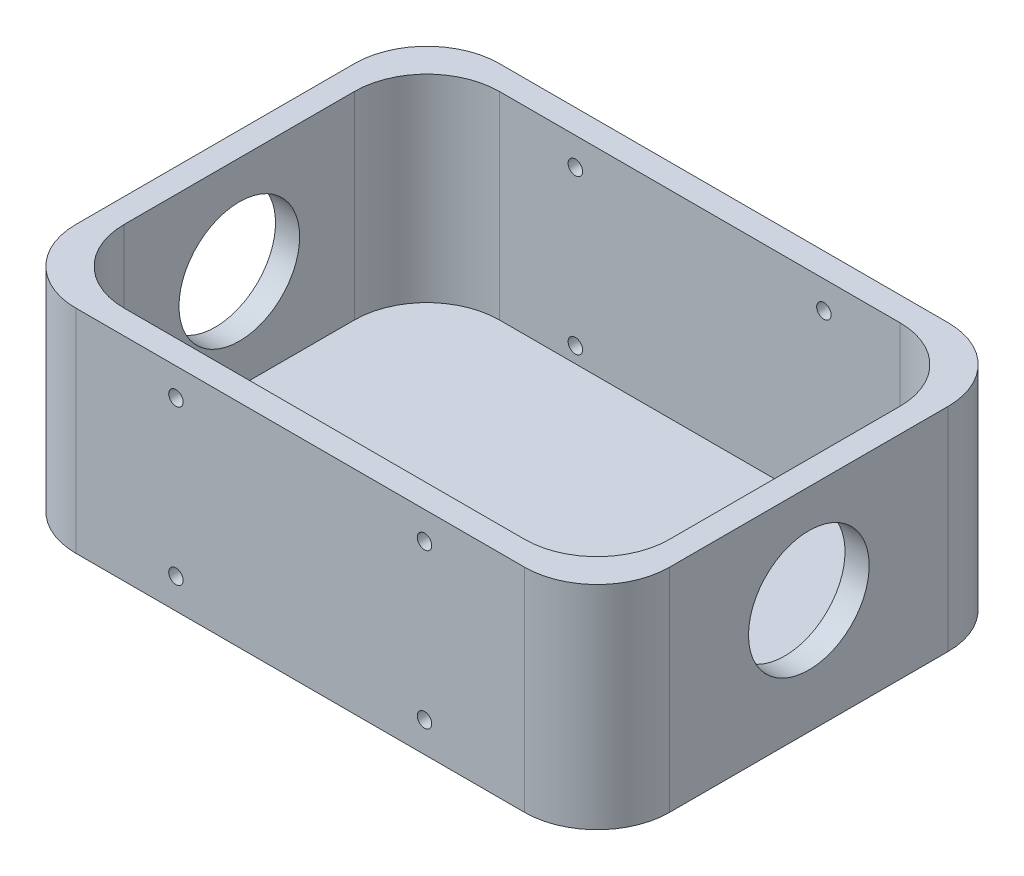
ISO-10303-21;
HEADER;
FILE_DESCRIPTION(('STEP AP214'),'2;1');
FILE_NAME('part.step','',(''),(''),'','','');
FILE_SCHEMA(('AUTOMOTIVE_DESIGN { 1 0 10303 214 1 1 1 1 }'));
ENDSEC;
DATA;
#1=APPLICATION_CONTEXT('core data for automotive mechanical design processes');
#2=APPLICATION_PROTOCOL_DEFINITION('international standard','automotive_design',2000,#1);
#3=PRODUCT_CONTEXT('',#1,'mechanical');
#4=PRODUCT('Part','Part','',(#3));
#5=PRODUCT_RELATED_PRODUCT_CATEGORY('part','',(#4));
#6=PRODUCT_DEFINITION_FORMATION('','',#4);
#7=PRODUCT_DEFINITION_CONTEXT('part definition',#1,'design');
#8=PRODUCT_DEFINITION('design','',#6,#7);
#9=PRODUCT_DEFINITION_SHAPE('','',#8);
#10=(LENGTH_UNIT() NAMED_UNIT(*) SI_UNIT(.MILLI.,.METRE.));
#11=(NAMED_UNIT(*) PLANE_ANGLE_UNIT() SI_UNIT($,.RADIAN.));
#12=(NAMED_UNIT(*) SI_UNIT($,.STERADIAN.) SOLID_ANGLE_UNIT());
#13=UNCERTAINTY_MEASURE_WITH_UNIT(LENGTH_MEASURE(1.E-05),#10,'distance_accuracy_value','');
#14=(GEOMETRIC_REPRESENTATION_CONTEXT(3) GLOBAL_UNCERTAINTY_ASSIGNED_CONTEXT((#13)) GLOBAL_UNIT_ASSIGNED_CONTEXT((#10,
#11,#12)) REPRESENTATION_CONTEXT('',''));
#15=CARTESIAN_POINT('',(0.,0.,0.));
#16=DIRECTION('',(0.,0.,1.));
#17=DIRECTION('',(1.,0.,0.));
#18=AXIS2_PLACEMENT_3D('',#15,#16,#17);
#19=CARTESIAN_POINT('',(41.5,44.,23.875));
#20=DIRECTION('',(0.,-1.,0.));
#21=DIRECTION('',(0.,0.,-1.));
#22=AXIS2_PLACEMENT_3D('',#19,#20,#21);
#23=CYLINDRICAL_SURFACE('',#22,15.);
#24=DIRECTION('',(0.,1.,0.));
#25=VECTOR('',#24,1.);
#26=CARTESIAN_POINT('',(56.5,44.,23.875));
#27=LINE('',#26,#25);
#28=CARTESIAN_POINT('',(56.5,3.,23.875));
#29=VERTEX_POINT('',#28);
#30=CARTESIAN_POINT('',(56.5,44.,23.875));
#31=VERTEX_POINT('',#30);
#32=EDGE_CURVE('E247',#29,#31,#27,.T.);
#33=ORIENTED_EDGE('',*,*,#32,.F.);
#34=CARTESIAN_POINT('',(41.5,3.,23.875));
#35=DIRECTION('',(0.,1.,0.));
#36=DIRECTION('',(0.,0.,1.));
#37=AXIS2_PLACEMENT_3D('',#34,#35,#36);
#38=CIRCLE('',#37,15.);
#39=CARTESIAN_POINT('',(41.5,3.,38.875));
#40=VERTEX_POINT('',#39);
#41=EDGE_CURVE('E42',#40,#29,#38,.T.);
#42=ORIENTED_EDGE('',*,*,#41,.F.);
#43=DIRECTION('',(0.,1.,0.));
#44=VECTOR('',#43,1.);
#45=CARTESIAN_POINT('',(41.5,44.,38.875));
#46=LINE('',#45,#44);
#47=CARTESIAN_POINT('',(41.5,44.,38.875));
#48=VERTEX_POINT('',#47);
#49=EDGE_CURVE('E250',#48,#40,#46,.F.);
#50=ORIENTED_EDGE('',*,*,#49,.F.);
#51=CARTESIAN_POINT('',(41.5,44.,23.875));
#52=DIRECTION('',(0.,-1.,0.));
#53=DIRECTION('',(0.,0.,-1.));
#54=AXIS2_PLACEMENT_3D('',#51,#52,#53);
#55=CIRCLE('',#54,15.);
#56=EDGE_CURVE('E11',#48,#31,#55,.F.);
#57=ORIENTED_EDGE('',*,*,#56,.T.);
#58=EDGE_LOOP('',(#33,#42,#50,#57));
#59=FACE_BOUND('',#58,.T.);
#60=ADVANCED_FACE('F34',(#59),#23,.F.);
#61=CARTESIAN_POINT('',(41.5,44.,-23.875));
#62=DIRECTION('',(0.,-1.,0.));
#63=DIRECTION('',(0.,0.,-1.));
#64=AXIS2_PLACEMENT_3D('',#61,#62,#63);
#65=CYLINDRICAL_SURFACE('',#64,15.);
#66=DIRECTION('',(0.,1.,0.));
#67=VECTOR('',#66,1.);
#68=CARTESIAN_POINT('',(41.5,44.,-38.875));
#69=LINE('',#68,#67);
#70=CARTESIAN_POINT('',(41.5,3.,-38.875));
#71=VERTEX_POINT('',#70);
#72=CARTESIAN_POINT('',(41.5,44.,-38.875));
#73=VERTEX_POINT('',#72);
#74=EDGE_CURVE('E237',#71,#73,#69,.T.);
#75=ORIENTED_EDGE('',*,*,#74,.F.);
#76=CARTESIAN_POINT('',(41.5,3.,-23.875));
#77=DIRECTION('',(0.,1.,0.));
#78=DIRECTION('',(0.,0.,1.));
#79=AXIS2_PLACEMENT_3D('',#76,#77,#78);
#80=CIRCLE('',#79,15.);
#81=CARTESIAN_POINT('',(56.5,3.,-23.875));
#82=VERTEX_POINT('',#81);
#83=EDGE_CURVE('E243',#82,#71,#80,.T.);
#84=ORIENTED_EDGE('',*,*,#83,.F.);
#85=DIRECTION('',(0.,1.,0.));
#86=VECTOR('',#85,1.);
#87=CARTESIAN_POINT('',(56.5,44.,-23.875));
#88=LINE('',#87,#86);
#89=CARTESIAN_POINT('',(56.5,44.,-23.875));
#90=VERTEX_POINT('',#89);
#91=EDGE_CURVE('E240',#90,#82,#88,.F.);
#92=ORIENTED_EDGE('',*,*,#91,.F.);
#93=CARTESIAN_POINT('',(41.5,44.,-23.875));
#94=DIRECTION('',(0.,-1.,0.));
#95=DIRECTION('',(0.,0.,-1.));
#96=AXIS2_PLACEMENT_3D('',#93,#94,#95);
#97=CIRCLE('',#96,15.);
#98=EDGE_CURVE('E245',#90,#73,#97,.F.);
#99=ORIENTED_EDGE('',*,*,#98,.T.);
#100=EDGE_LOOP('',(#75,#84,#92,#99));
#101=FACE_BOUND('',#100,.T.);
#102=ADVANCED_FACE('F340',(#101),#65,.F.);
#103=CARTESIAN_POINT('',(-41.5,44.,23.875));
#104=DIRECTION('',(0.,-1.,0.));
#105=DIRECTION('',(0.,0.,-1.));
#106=AXIS2_PLACEMENT_3D('',#103,#104,#105);
#107=CYLINDRICAL_SURFACE('',#106,15.);
#108=DIRECTION('',(0.,1.,0.));
#109=VECTOR('',#108,1.);
#110=CARTESIAN_POINT('',(-41.5,44.,38.875));
#111=LINE('',#110,#109);
#112=CARTESIAN_POINT('',(-41.5,3.,38.875));
#113=VERTEX_POINT('',#112);
#114=CARTESIAN_POINT('',(-41.5,44.,38.875));
#115=VERTEX_POINT('',#114);
#116=EDGE_CURVE('E227',#113,#115,#111,.T.);
#117=ORIENTED_EDGE('',*,*,#116,.F.);
#118=CARTESIAN_POINT('',(-41.5,3.,23.875));
#119=DIRECTION('',(0.,1.,0.));
#120=DIRECTION('',(0.,0.,1.));
#121=AXIS2_PLACEMENT_3D('',#118,#119,#120);
#122=CIRCLE('',#121,15.);
#123=CARTESIAN_POINT('',(-56.5,3.,23.875));
#124=VERTEX_POINT('',#123);
#125=EDGE_CURVE('E233',#124,#113,#122,.T.);
#126=ORIENTED_EDGE('',*,*,#125,.F.);
#127=DIRECTION('',(0.,1.,0.));
#128=VECTOR('',#127,1.);
#129=CARTESIAN_POINT('',(-56.5,44.,23.875));
#130=LINE('',#129,#128);
#131=CARTESIAN_POINT('',(-56.5,44.,23.875));
#132=VERTEX_POINT('',#131);
#133=EDGE_CURVE('E230',#132,#124,#130,.F.);
#134=ORIENTED_EDGE('',*,*,#133,.F.);
#135=CARTESIAN_POINT('',(-41.5,44.,23.875));
#136=DIRECTION('',(0.,-1.,0.));
#137=DIRECTION('',(0.,0.,-1.));
#138=AXIS2_PLACEMENT_3D('',#135,#136,#137);
#139=CIRCLE('',#138,15.);
#140=EDGE_CURVE('E235',#132,#115,#139,.F.);
#141=ORIENTED_EDGE('',*,*,#140,.T.);
#142=EDGE_LOOP('',(#117,#126,#134,#141));
#143=FACE_BOUND('',#142,.T.);
#144=ADVANCED_FACE('F344',(#143),#107,.F.);
#145=CARTESIAN_POINT('',(-41.5,44.,-23.875));
#146=DIRECTION('',(0.,1.,0.));
#147=DIRECTION('',(0.,0.,1.));
#148=AXIS2_PLACEMENT_3D('',#145,#146,#147);
#149=CYLINDRICAL_SURFACE('',#148,15.);
#150=DIRECTION('',(0.,-1.,0.));
#151=VECTOR('',#150,1.);
#152=CARTESIAN_POINT('',(-41.5,44.,-38.875));
#153=LINE('',#152,#151);
#154=CARTESIAN_POINT('',(-41.5,44.,-38.875));
#155=VERTEX_POINT('',#154);
#156=CARTESIAN_POINT('',(-41.5,3.,-38.875));
#157=VERTEX_POINT('',#156);
#158=EDGE_CURVE('E216',#155,#157,#153,.T.);
#159=ORIENTED_EDGE('',*,*,#158,.F.);
#160=CARTESIAN_POINT('',(-41.5,44.,-23.875));
#161=DIRECTION('',(0.,-1.,0.));
#162=DIRECTION('',(0.,0.,-1.));
#163=AXIS2_PLACEMENT_3D('',#160,#161,#162);
#164=CIRCLE('',#163,15.);
#165=CARTESIAN_POINT('',(-56.5,44.,-23.875));
#166=VERTEX_POINT('',#165);
#167=EDGE_CURVE('E225',#155,#166,#164,.F.);
#168=ORIENTED_EDGE('',*,*,#167,.T.);
#169=DIRECTION('',(0.,-1.,0.));
#170=VECTOR('',#169,1.);
#171=CARTESIAN_POINT('',(-56.5,44.,-23.875));
#172=LINE('',#171,#170);
#173=CARTESIAN_POINT('',(-56.5,3.,-23.875));
#174=VERTEX_POINT('',#173);
#175=EDGE_CURVE('E219',#174,#166,#172,.F.);
#176=ORIENTED_EDGE('',*,*,#175,.F.);
#177=CARTESIAN_POINT('',(-41.5,3.,-23.875));
#178=DIRECTION('',(0.,1.,0.));
#179=DIRECTION('',(0.,0.,1.));
#180=AXIS2_PLACEMENT_3D('',#177,#178,#179);
#181=CIRCLE('',#180,15.);
#182=EDGE_CURVE('E222',#157,#174,#181,.T.);
#183=ORIENTED_EDGE('',*,*,#182,.F.);
#184=EDGE_LOOP('',(#159,#168,#176,#183));
#185=FACE_BOUND('',#184,.T.);
#186=ADVANCED_FACE('F337',(#185),#149,.F.);
#187=CARTESIAN_POINT('',(46.5,44.,28.875));
#188=DIRECTION('',(0.,-1.,0.));
#189=DIRECTION('',(0.,0.,-1.));
#190=AXIS2_PLACEMENT_3D('',#187,#188,#189);
#191=CYLINDRICAL_SURFACE('',#190,15.);
#192=DIRECTION('',(0.,-1.,0.));
#193=VECTOR('',#192,1.);
#194=CARTESIAN_POINT('',(61.5,44.,28.875));
#195=LINE('',#194,#193);
#196=CARTESIAN_POINT('',(61.5,44.,28.875));
#197=VERTEX_POINT('',#196);
#198=CARTESIAN_POINT('',(61.5,0.,28.875));
#199=VERTEX_POINT('',#198);
#200=EDGE_CURVE('E208',#197,#199,#195,.T.);
#201=ORIENTED_EDGE('',*,*,#200,.F.);
#202=CARTESIAN_POINT('',(46.5,44.,28.875));
#203=DIRECTION('',(0.,-1.,0.));
#204=DIRECTION('',(0.,0.,-1.));
#205=AXIS2_PLACEMENT_3D('',#202,#203,#204);
#206=CIRCLE('',#205,15.);
#207=CARTESIAN_POINT('',(46.5,44.,43.875));
#208=VERTEX_POINT('',#207);
#209=EDGE_CURVE('E213',#208,#197,#206,.F.);
#210=ORIENTED_EDGE('',*,*,#209,.F.);
#211=DIRECTION('',(0.,-1.,0.));
#212=VECTOR('',#211,1.);
#213=CARTESIAN_POINT('',(46.5,44.,43.875));
#214=LINE('',#213,#212);
#215=CARTESIAN_POINT('',(46.5,0.,43.875));
#216=VERTEX_POINT('',#215);
#217=EDGE_CURVE('E211',#216,#208,#214,.F.);
#218=ORIENTED_EDGE('',*,*,#217,.F.);
#219=CARTESIAN_POINT('',(46.5,0.,28.875));
#220=DIRECTION('',(0.,-1.,0.));
#221=DIRECTION('',(0.,0.,-1.));
#222=AXIS2_PLACEMENT_3D('',#219,#220,#221);
#223=CIRCLE('',#222,15.);
#224=EDGE_CURVE('E172',#199,#216,#223,.T.);
#225=ORIENTED_EDGE('',*,*,#224,.F.);
#226=EDGE_LOOP('',(#201,#210,#218,#225));
#227=FACE_BOUND('',#226,.T.);
#228=ADVANCED_FACE('F324',(#227),#191,.T.);
#229=CARTESIAN_POINT('',(46.5,44.,-28.875));
#230=DIRECTION('',(0.,-1.,0.));
#231=DIRECTION('',(0.,0.,-1.));
#232=AXIS2_PLACEMENT_3D('',#229,#230,#231);
#233=CYLINDRICAL_SURFACE('',#232,15.);
#234=DIRECTION('',(0.,-1.,0.));
#235=VECTOR('',#234,1.);
#236=CARTESIAN_POINT('',(46.5,44.,-43.875));
#237=LINE('',#236,#235);
#238=CARTESIAN_POINT('',(46.5,44.,-43.875));
#239=VERTEX_POINT('',#238);
#240=CARTESIAN_POINT('',(46.5,0.,-43.875));
#241=VERTEX_POINT('',#240);
#242=EDGE_CURVE('E197',#239,#241,#237,.T.);
#243=ORIENTED_EDGE('',*,*,#242,.F.);
#244=CARTESIAN_POINT('',(46.5,44.,-28.875));
#245=DIRECTION('',(0.,-1.,0.));
#246=DIRECTION('',(0.,0.,-1.));
#247=AXIS2_PLACEMENT_3D('',#244,#245,#246);
#248=CIRCLE('',#247,15.);
#249=CARTESIAN_POINT('',(61.5,44.,-28.875));
#250=VERTEX_POINT('',#249);
#251=EDGE_CURVE('E203',#250,#239,#248,.F.);
#252=ORIENTED_EDGE('',*,*,#251,.F.);
#253=DIRECTION('',(0.,-1.,0.));
#254=VECTOR('',#253,1.);
#255=CARTESIAN_POINT('',(61.5,44.,-28.875));
#256=LINE('',#255,#254);
#257=CARTESIAN_POINT('',(61.5,0.,-28.875));
#258=VERTEX_POINT('',#257);
#259=EDGE_CURVE('E200',#258,#250,#256,.F.);
#260=ORIENTED_EDGE('',*,*,#259,.F.);
#261=CARTESIAN_POINT('',(46.5,0.,-28.875));
#262=DIRECTION('',(0.,-1.,0.));
#263=DIRECTION('',(0.,0.,-1.));
#264=AXIS2_PLACEMENT_3D('',#261,#262,#263);
#265=CIRCLE('',#264,15.);
#266=EDGE_CURVE('E205',#241,#258,#265,.T.);
#267=ORIENTED_EDGE('',*,*,#266,.F.);
#268=EDGE_LOOP('',(#243,#252,#260,#267));
#269=FACE_BOUND('',#268,.T.);
#270=ADVANCED_FACE('F329',(#269),#233,.T.);
#271=CARTESIAN_POINT('',(-46.5,44.,-28.875));
#272=DIRECTION('',(0.,-1.,0.));
#273=DIRECTION('',(0.,0.,-1.));
#274=AXIS2_PLACEMENT_3D('',#271,#272,#273);
#275=CYLINDRICAL_SURFACE('',#274,15.);
#276=DIRECTION('',(0.,-1.,0.));
#277=VECTOR('',#276,1.);
#278=CARTESIAN_POINT('',(-61.5,44.,-28.875));
#279=LINE('',#278,#277);
#280=CARTESIAN_POINT('',(-61.5,44.,-28.875));
#281=VERTEX_POINT('',#280);
#282=CARTESIAN_POINT('',(-61.5,0.,-28.875));
#283=VERTEX_POINT('',#282);
#284=EDGE_CURVE('E158',#281,#283,#279,.T.);
#285=ORIENTED_EDGE('',*,*,#284,.F.);
#286=CARTESIAN_POINT('',(-46.5,44.,-28.875));
#287=DIRECTION('',(0.,-1.,0.));
#288=DIRECTION('',(0.,0.,-1.));
#289=AXIS2_PLACEMENT_3D('',#286,#287,#288);
#290=CIRCLE('',#289,15.);
#291=CARTESIAN_POINT('',(-46.5,44.,-43.875));
#292=VERTEX_POINT('',#291);
#293=EDGE_CURVE('E192',#292,#281,#290,.F.);
#294=ORIENTED_EDGE('',*,*,#293,.F.);
#295=DIRECTION('',(0.,-1.,0.));
#296=VECTOR('',#295,1.);
#297=CARTESIAN_POINT('',(-46.5,44.,-43.875));
#298=LINE('',#297,#296);
#299=CARTESIAN_POINT('',(-46.5,0.,-43.875));
#300=VERTEX_POINT('',#299);
#301=EDGE_CURVE('E189',#300,#292,#298,.F.);
#302=ORIENTED_EDGE('',*,*,#301,.F.);
#303=CARTESIAN_POINT('',(-46.5,0.,-28.875));
#304=DIRECTION('',(0.,-1.,0.));
#305=DIRECTION('',(0.,0.,-1.));
#306=AXIS2_PLACEMENT_3D('',#303,#304,#305);
#307=CIRCLE('',#306,15.);
#308=EDGE_CURVE('E194',#283,#300,#307,.T.);
#309=ORIENTED_EDGE('',*,*,#308,.F.);
#310=EDGE_LOOP('',(#285,#294,#302,#309));
#311=FACE_BOUND('',#310,.T.);
#312=ADVANCED_FACE('F315',(#311),#275,.T.);
#313=CARTESIAN_POINT('',(-46.5,44.,28.875));
#314=DIRECTION('',(0.,-1.,0.));
#315=DIRECTION('',(0.,0.,-1.));
#316=AXIS2_PLACEMENT_3D('',#313,#314,#315);
#317=CYLINDRICAL_SURFACE('',#316,15.);
#318=DIRECTION('',(0.,-1.,0.));
#319=VECTOR('',#318,1.);
#320=CARTESIAN_POINT('',(-46.5,44.,43.875));
#321=LINE('',#320,#319);
#322=CARTESIAN_POINT('',(-46.5,44.,43.875));
#323=VERTEX_POINT('',#322);
#324=CARTESIAN_POINT('',(-46.5,0.,43.875));
#325=VERTEX_POINT('',#324);
#326=EDGE_CURVE('E151',#323,#325,#321,.T.);
#327=ORIENTED_EDGE('',*,*,#326,.F.);
#328=CARTESIAN_POINT('',(-46.5,44.,28.875));
#329=DIRECTION('',(0.,-1.,0.));
#330=DIRECTION('',(0.,0.,-1.));
#331=AXIS2_PLACEMENT_3D('',#328,#329,#330);
#332=CIRCLE('',#331,15.);
#333=CARTESIAN_POINT('',(-61.5,44.,28.875));
#334=VERTEX_POINT('',#333);
#335=EDGE_CURVE('E159',#334,#323,#332,.F.);
#336=ORIENTED_EDGE('',*,*,#335,.F.);
#337=DIRECTION('',(0.,-1.,0.));
#338=VECTOR('',#337,1.);
#339=CARTESIAN_POINT('',(-61.5,44.,28.875));
#340=LINE('',#339,#338);
#341=CARTESIAN_POINT('',(-61.5,0.,28.875));
#342=VERTEX_POINT('',#341);
#343=EDGE_CURVE('E154',#342,#334,#340,.F.);
#344=ORIENTED_EDGE('',*,*,#343,.F.);
#345=CARTESIAN_POINT('',(-46.5,0.,28.875));
#346=DIRECTION('',(0.,-1.,0.));
#347=DIRECTION('',(0.,0.,-1.));
#348=AXIS2_PLACEMENT_3D('',#345,#346,#347);
#349=CIRCLE('',#348,15.);
#350=EDGE_CURVE('E147',#325,#342,#349,.T.);
#351=ORIENTED_EDGE('',*,*,#350,.F.);
#352=EDGE_LOOP('',(#327,#336,#344,#351));
#353=FACE_BOUND('',#352,.T.);
#354=ADVANCED_FACE('F149',(#353),#317,.T.);
#355=CARTESIAN_POINT('',(0.,44.,0.));
#356=DIRECTION('',(0.,-1.,0.));
#357=DIRECTION('',(0.,0.,-1.));
#358=AXIS2_PLACEMENT_3D('',#355,#356,#357);
#359=PLANE('',#358);
#360=DIRECTION('',(1.,0.,0.));
#361=VECTOR('',#360,1.);
#362=CARTESIAN_POINT('',(-61.5,44.,43.875));
#363=LINE('',#362,#361);
#364=EDGE_CURVE('E167',#323,#208,#363,.T.);
#365=ORIENTED_EDGE('',*,*,#364,.T.);
#366=ORIENTED_EDGE('',*,*,#209,.T.);
#367=DIRECTION('',(0.,0.,-1.));
#368=VECTOR('',#367,1.);
#369=CARTESIAN_POINT('',(61.5,44.,43.875));
#370=LINE('',#369,#368);
#371=EDGE_CURVE('E304',#197,#250,#370,.T.);
#372=ORIENTED_EDGE('',*,*,#371,.T.);
#373=ORIENTED_EDGE('',*,*,#251,.T.);
#374=DIRECTION('',(-1.,0.,0.));
#375=VECTOR('',#374,1.);
#376=CARTESIAN_POINT('',(-61.5,44.,-43.875));
#377=LINE('',#376,#375);
#378=EDGE_CURVE('E168',#239,#292,#377,.T.);
#379=ORIENTED_EDGE('',*,*,#378,.T.);
#380=ORIENTED_EDGE('',*,*,#293,.T.);
#381=DIRECTION('',(0.,0.,1.));
#382=VECTOR('',#381,1.);
#383=CARTESIAN_POINT('',(-61.5,44.,43.875));
#384=LINE('',#383,#382);
#385=EDGE_CURVE('E183',#281,#334,#384,.T.);
#386=ORIENTED_EDGE('',*,*,#385,.T.);
#387=ORIENTED_EDGE('',*,*,#335,.T.);
#388=EDGE_LOOP('',(#365,#366,#372,#373,#379,#380,#386,#387));
#389=FACE_BOUND('',#388,.T.);
#390=DIRECTION('',(1.,0.,0.));
#391=VECTOR('',#390,1.);
#392=CARTESIAN_POINT('',(-56.5,44.,38.875));
#393=LINE('',#392,#391);
#394=EDGE_CURVE('E293',#115,#48,#393,.T.);
#395=ORIENTED_EDGE('',*,*,#394,.F.);
#396=ORIENTED_EDGE('',*,*,#140,.F.);
#397=DIRECTION('',(0.,0.,1.));
#398=VECTOR('',#397,1.);
#399=CARTESIAN_POINT('',(-56.5,44.,38.875));
#400=LINE('',#399,#398);
#401=EDGE_CURVE('E179',#166,#132,#400,.T.);
#402=ORIENTED_EDGE('',*,*,#401,.F.);
#403=ORIENTED_EDGE('',*,*,#167,.F.);
#404=DIRECTION('',(-1.,0.,0.));
#405=VECTOR('',#404,1.);
#406=CARTESIAN_POINT('',(-56.5,44.,-38.875));
#407=LINE('',#406,#405);
#408=EDGE_CURVE('E298',#73,#155,#407,.T.);
#409=ORIENTED_EDGE('',*,*,#408,.F.);
#410=ORIENTED_EDGE('',*,*,#98,.F.);
#411=DIRECTION('',(0.,0.,-1.));
#412=VECTOR('',#411,1.);
#413=CARTESIAN_POINT('',(56.5,44.,38.875));
#414=LINE('',#413,#412);
#415=EDGE_CURVE('E296',#31,#90,#414,.T.);
#416=ORIENTED_EDGE('',*,*,#415,.F.);
#417=ORIENTED_EDGE('',*,*,#56,.F.);
#418=EDGE_LOOP('',(#395,#396,#402,#403,#409,#410,#416,#417));
#419=FACE_BOUND('',#418,.T.);
#420=ADVANCED_FACE('F308',(#389,#419),#359,.F.);
#421=CARTESIAN_POINT('',(0.,0.,0.));
#422=DIRECTION('',(0.,-1.,0.));
#423=DIRECTION('',(0.,0.,-1.));
#424=AXIS2_PLACEMENT_3D('',#421,#422,#423);
#425=PLANE('',#424);
#426=DIRECTION('',(0.,0.,-1.));
#427=VECTOR('',#426,1.);
#428=CARTESIAN_POINT('',(61.5,0.,43.875));
#429=LINE('',#428,#427);
#430=EDGE_CURVE('E174',#199,#258,#429,.T.);
#431=ORIENTED_EDGE('',*,*,#430,.F.);
#432=ORIENTED_EDGE('',*,*,#224,.T.);
#433=DIRECTION('',(1.,0.,0.));
#434=VECTOR('',#433,1.);
#435=CARTESIAN_POINT('',(-61.5,0.,43.875));
#436=LINE('',#435,#434);
#437=EDGE_CURVE('E165',#325,#216,#436,.T.);
#438=ORIENTED_EDGE('',*,*,#437,.F.);
#439=ORIENTED_EDGE('',*,*,#350,.T.);
#440=DIRECTION('',(0.,0.,1.));
#441=VECTOR('',#440,1.);
#442=CARTESIAN_POINT('',(-61.5,0.,43.875));
#443=LINE('',#442,#441);
#444=EDGE_CURVE('E175',#283,#342,#443,.T.);
#445=ORIENTED_EDGE('',*,*,#444,.F.);
#446=ORIENTED_EDGE('',*,*,#308,.T.);
#447=DIRECTION('',(-1.,0.,0.));
#448=VECTOR('',#447,1.);
#449=CARTESIAN_POINT('',(-61.5,0.,-43.875));
#450=LINE('',#449,#448);
#451=EDGE_CURVE('E177',#241,#300,#450,.T.);
#452=ORIENTED_EDGE('',*,*,#451,.F.);
#453=ORIENTED_EDGE('',*,*,#266,.T.);
#454=EDGE_LOOP('',(#431,#432,#438,#439,#445,#446,#452,#453));
#455=FACE_BOUND('',#454,.T.);
#456=ADVANCED_FACE('F171',(#455),#425,.T.);
#457=CARTESIAN_POINT('',(-61.5,44.,43.875));
#458=DIRECTION('',(1.,0.,0.));
#459=DIRECTION('',(0.,0.,-1.));
#460=AXIS2_PLACEMENT_3D('',#457,#458,#459);
#461=PLANE('',#460);
#462=CARTESIAN_POINT('',(-61.5,23.62,0.));
#463=DIRECTION('',(-1.,0.,0.));
#464=DIRECTION('',(0.,0.,1.));
#465=AXIS2_PLACEMENT_3D('',#462,#463,#464);
#466=CIRCLE('',#465,12.5);
#467=CARTESIAN_POINT('',(-61.5,23.62,12.5));
#468=VERTEX_POINT('',#467);
#469=EDGE_CURVE('E540',#468,#468,#466,.T.);
#470=ORIENTED_EDGE('',*,*,#469,.F.);
#471=EDGE_LOOP('',(#470));
#472=FACE_BOUND('',#471,.T.);
#473=ORIENTED_EDGE('',*,*,#385,.F.);
#474=ORIENTED_EDGE('',*,*,#284,.T.);
#475=ORIENTED_EDGE('',*,*,#444,.T.);
#476=ORIENTED_EDGE('',*,*,#343,.T.);
#477=EDGE_LOOP('',(#473,#474,#475,#476));
#478=FACE_BOUND('',#477,.T.);
#479=ADVANCED_FACE('F320',(#472,#478),#461,.F.);
#480=CARTESIAN_POINT('',(-61.5,44.,43.875));
#481=DIRECTION('',(0.,0.,-1.));
#482=DIRECTION('',(-1.,0.,0.));
#483=AXIS2_PLACEMENT_3D('',#480,#481,#482);
#484=PLANE('',#483);
#485=CARTESIAN_POINT('',(25.75,38.25,43.875));
#486=DIRECTION('',(0.,0.,-1.));
#487=DIRECTION('',(-1.,0.,0.));
#488=AXIS2_PLACEMENT_3D('',#485,#486,#487);
#489=CIRCLE('',#488,1.5);
#490=CARTESIAN_POINT('',(24.25,38.25,43.875));
#491=VERTEX_POINT('',#490);
#492=EDGE_CURVE('E554',#491,#491,#489,.T.);
#493=ORIENTED_EDGE('',*,*,#492,.T.);
#494=EDGE_LOOP('',(#493));
#495=FACE_BOUND('',#494,.T.);
#496=CARTESIAN_POINT('',(-25.75,38.25,43.875));
#497=DIRECTION('',(0.,0.,1.));
#498=DIRECTION('',(1.,0.,0.));
#499=AXIS2_PLACEMENT_3D('',#496,#497,#498);
#500=CIRCLE('',#499,1.5);
#501=CARTESIAN_POINT('',(-24.25,38.25,43.875));
#502=VERTEX_POINT('',#501);
#503=EDGE_CURVE('E272',#502,#502,#500,.T.);
#504=ORIENTED_EDGE('',*,*,#503,.F.);
#505=EDGE_LOOP('',(#504));
#506=FACE_BOUND('',#505,.T.);
#507=CARTESIAN_POINT('',(-25.75,6.25,43.875));
#508=DIRECTION('',(0.,0.,1.));
#509=DIRECTION('',(1.,0.,0.));
#510=AXIS2_PLACEMENT_3D('',#507,#508,#509);
#511=CIRCLE('',#510,1.5);
#512=CARTESIAN_POINT('',(-24.25,6.25,43.875));
#513=VERTEX_POINT('',#512);
#514=EDGE_CURVE('E260',#513,#513,#511,.T.);
#515=ORIENTED_EDGE('',*,*,#514,.F.);
#516=EDGE_LOOP('',(#515));
#517=FACE_BOUND('',#516,.T.);
#518=CARTESIAN_POINT('',(25.75,6.25,43.875));
#519=DIRECTION('',(0.,0.,-1.));
#520=DIRECTION('',(-1.,0.,0.));
#521=AXIS2_PLACEMENT_3D('',#518,#519,#520);
#522=CIRCLE('',#521,1.5);
#523=CARTESIAN_POINT('',(24.25,6.25,43.875));
#524=VERTEX_POINT('',#523);
#525=EDGE_CURVE('E256',#524,#524,#522,.T.);
#526=ORIENTED_EDGE('',*,*,#525,.T.);
#527=EDGE_LOOP('',(#526));
#528=FACE_BOUND('',#527,.T.);
#529=ORIENTED_EDGE('',*,*,#437,.T.);
#530=ORIENTED_EDGE('',*,*,#217,.T.);
#531=ORIENTED_EDGE('',*,*,#364,.F.);
#532=ORIENTED_EDGE('',*,*,#326,.T.);
#533=EDGE_LOOP('',(#529,#530,#531,#532));
#534=FACE_BOUND('',#533,.T.);
#535=ADVANCED_FACE('F163',(#495,#506,#517,#528,#534),#484,.F.);
#536=CARTESIAN_POINT('',(61.5,44.,43.875));
#537=DIRECTION('',(-1.,0.,0.));
#538=DIRECTION('',(0.,0.,1.));
#539=AXIS2_PLACEMENT_3D('',#536,#537,#538);
#540=PLANE('',#539);
#541=CARTESIAN_POINT('',(61.5,23.62,0.));
#542=DIRECTION('',(-1.,0.,0.));
#543=DIRECTION('',(0.,0.,1.));
#544=AXIS2_PLACEMENT_3D('',#541,#542,#543);
#545=CIRCLE('',#544,12.5);
#546=CARTESIAN_POINT('',(61.5,23.62,12.5));
#547=VERTEX_POINT('',#546);
#548=EDGE_CURVE('E536',#547,#547,#545,.T.);
#549=ORIENTED_EDGE('',*,*,#548,.T.);
#550=EDGE_LOOP('',(#549));
#551=FACE_BOUND('',#550,.T.);
#552=ORIENTED_EDGE('',*,*,#371,.F.);
#553=ORIENTED_EDGE('',*,*,#200,.T.);
#554=ORIENTED_EDGE('',*,*,#430,.T.);
#555=ORIENTED_EDGE('',*,*,#259,.T.);
#556=EDGE_LOOP('',(#552,#553,#554,#555));
#557=FACE_BOUND('',#556,.T.);
#558=ADVANCED_FACE('F326',(#551,#557),#540,.F.);
#559=CARTESIAN_POINT('',(-61.5,44.,-43.875));
#560=DIRECTION('',(0.,0.,1.));
#561=DIRECTION('',(1.,0.,0.));
#562=AXIS2_PLACEMENT_3D('',#559,#560,#561);
#563=PLANE('',#562);
#564=CARTESIAN_POINT('',(-25.75,38.25,-43.875));
#565=DIRECTION('',(0.,0.,1.));
#566=DIRECTION('',(1.,0.,0.));
#567=AXIS2_PLACEMENT_3D('',#564,#565,#566);
#568=CIRCLE('',#567,1.5);
#569=CARTESIAN_POINT('',(-24.25,38.25,-43.875));
#570=VERTEX_POINT('',#569);
#571=EDGE_CURVE('E548',#570,#570,#568,.T.);
#572=ORIENTED_EDGE('',*,*,#571,.T.);
#573=EDGE_LOOP('',(#572));
#574=FACE_BOUND('',#573,.T.);
#575=CARTESIAN_POINT('',(25.75,38.25,-43.875));
#576=DIRECTION('',(0.,0.,-1.));
#577=DIRECTION('',(-1.,0.,0.));
#578=AXIS2_PLACEMENT_3D('',#575,#576,#577);
#579=CIRCLE('',#578,1.5);
#580=CARTESIAN_POINT('',(24.25,38.25,-43.875));
#581=VERTEX_POINT('',#580);
#582=EDGE_CURVE('E560',#581,#581,#579,.T.);
#583=ORIENTED_EDGE('',*,*,#582,.F.);
#584=EDGE_LOOP('',(#583));
#585=FACE_BOUND('',#584,.T.);
#586=CARTESIAN_POINT('',(-25.75,6.25,-43.875));
#587=DIRECTION('',(0.,0.,1.));
#588=DIRECTION('',(1.,0.,0.));
#589=AXIS2_PLACEMENT_3D('',#586,#587,#588);
#590=CIRCLE('',#589,1.5);
#591=CARTESIAN_POINT('',(-24.25,6.25,-43.875));
#592=VERTEX_POINT('',#591);
#593=EDGE_CURVE('E267',#592,#592,#590,.T.);
#594=ORIENTED_EDGE('',*,*,#593,.T.);
#595=EDGE_LOOP('',(#594));
#596=FACE_BOUND('',#595,.T.);
#597=CARTESIAN_POINT('',(25.75,6.25,-43.875));
#598=DIRECTION('',(0.,0.,-1.));
#599=DIRECTION('',(-1.,0.,0.));
#600=AXIS2_PLACEMENT_3D('',#597,#598,#599);
#601=CIRCLE('',#600,1.5);
#602=CARTESIAN_POINT('',(24.25,6.25,-43.875));
#603=VERTEX_POINT('',#602);
#604=EDGE_CURVE('E264',#603,#603,#601,.T.);
#605=ORIENTED_EDGE('',*,*,#604,.F.);
#606=EDGE_LOOP('',(#605));
#607=FACE_BOUND('',#606,.T.);
#608=ORIENTED_EDGE('',*,*,#378,.F.);
#609=ORIENTED_EDGE('',*,*,#242,.T.);
#610=ORIENTED_EDGE('',*,*,#451,.T.);
#611=ORIENTED_EDGE('',*,*,#301,.T.);
#612=EDGE_LOOP('',(#608,#609,#610,#611));
#613=FACE_BOUND('',#612,.T.);
#614=ADVANCED_FACE('F317',(#574,#585,#596,#607,#613),#563,.F.);
#615=CARTESIAN_POINT('',(-56.5,44.,38.875));
#616=DIRECTION('',(0.,0.,-1.));
#617=DIRECTION('',(-1.,0.,0.));
#618=AXIS2_PLACEMENT_3D('',#615,#616,#617);
#619=PLANE('',#618);
#620=CARTESIAN_POINT('',(25.75,38.25,38.875));
#621=DIRECTION('',(0.,0.,-1.));
#622=DIRECTION('',(-1.,0.,0.));
#623=AXIS2_PLACEMENT_3D('',#620,#621,#622);
#624=CIRCLE('',#623,1.5);
#625=CARTESIAN_POINT('',(24.25,38.25,38.875));
#626=VERTEX_POINT('',#625);
#627=EDGE_CURVE('E551',#626,#626,#624,.T.);
#628=ORIENTED_EDGE('',*,*,#627,.F.);
#629=EDGE_LOOP('',(#628));
#630=FACE_BOUND('',#629,.T.);
#631=CARTESIAN_POINT('',(-25.75,38.25,38.875));
#632=DIRECTION('',(0.,0.,-1.));
#633=DIRECTION('',(-1.,0.,0.));
#634=AXIS2_PLACEMENT_3D('',#631,#632,#633);
#635=CIRCLE('',#634,1.5);
#636=CARTESIAN_POINT('',(-27.25,38.25,38.875));
#637=VERTEX_POINT('',#636);
#638=EDGE_CURVE('E562',#637,#637,#635,.F.);
#639=ORIENTED_EDGE('',*,*,#638,.T.);
#640=EDGE_LOOP('',(#639));
#641=FACE_BOUND('',#640,.T.);
#642=CARTESIAN_POINT('',(-25.75,6.25,38.875));
#643=DIRECTION('',(0.,0.,-1.));
#644=DIRECTION('',(-1.,0.,0.));
#645=AXIS2_PLACEMENT_3D('',#642,#643,#644);
#646=CIRCLE('',#645,1.5);
#647=CARTESIAN_POINT('',(-27.25,6.25,38.875));
#648=VERTEX_POINT('',#647);
#649=EDGE_CURVE('E259',#648,#648,#646,.F.);
#650=ORIENTED_EDGE('',*,*,#649,.T.);
#651=EDGE_LOOP('',(#650));
#652=FACE_BOUND('',#651,.T.);
#653=CARTESIAN_POINT('',(25.75,6.25,38.875));
#654=DIRECTION('',(0.,0.,-1.));
#655=DIRECTION('',(-1.,0.,0.));
#656=AXIS2_PLACEMENT_3D('',#653,#654,#655);
#657=CIRCLE('',#656,1.5);
#658=CARTESIAN_POINT('',(24.25,6.25,38.875));
#659=VERTEX_POINT('',#658);
#660=EDGE_CURVE('E255',#659,#659,#657,.T.);
#661=ORIENTED_EDGE('',*,*,#660,.F.);
#662=EDGE_LOOP('',(#661));
#663=FACE_BOUND('',#662,.T.);
#664=ORIENTED_EDGE('',*,*,#394,.T.);
#665=ORIENTED_EDGE('',*,*,#49,.T.);
#666=DIRECTION('',(1.,0.,0.));
#667=VECTOR('',#666,1.);
#668=CARTESIAN_POINT('',(0.,3.,38.875));
#669=LINE('',#668,#667);
#670=EDGE_CURVE('E285',#113,#40,#669,.T.);
#671=ORIENTED_EDGE('',*,*,#670,.F.);
#672=ORIENTED_EDGE('',*,*,#116,.T.);
#673=EDGE_LOOP('',(#664,#665,#671,#672));
#674=FACE_BOUND('',#673,.T.);
#675=ADVANCED_FACE('F372',(#630,#641,#652,#663,#674),#619,.T.);
#676=CARTESIAN_POINT('',(56.5,44.,38.875));
#677=DIRECTION('',(-1.,0.,0.));
#678=DIRECTION('',(0.,0.,1.));
#679=AXIS2_PLACEMENT_3D('',#676,#677,#678);
#680=PLANE('',#679);
#681=CARTESIAN_POINT('',(56.5,23.62,0.));
#682=DIRECTION('',(-1.,0.,0.));
#683=DIRECTION('',(0.,0.,1.));
#684=AXIS2_PLACEMENT_3D('',#681,#682,#683);
#685=CIRCLE('',#684,12.5);
#686=CARTESIAN_POINT('',(56.5,23.62,12.5));
#687=VERTEX_POINT('',#686);
#688=EDGE_CURVE('E535',#687,#687,#685,.T.);
#689=ORIENTED_EDGE('',*,*,#688,.F.);
#690=EDGE_LOOP('',(#689));
#691=FACE_BOUND('',#690,.T.);
#692=DIRECTION('',(0.,0.,-1.));
#693=VECTOR('',#692,1.);
#694=CARTESIAN_POINT('',(56.5,3.,0.));
#695=LINE('',#694,#693);
#696=EDGE_CURVE('E288',#29,#82,#695,.T.);
#697=ORIENTED_EDGE('',*,*,#696,.F.);
#698=ORIENTED_EDGE('',*,*,#32,.T.);
#699=ORIENTED_EDGE('',*,*,#415,.T.);
#700=ORIENTED_EDGE('',*,*,#91,.T.);
#701=EDGE_LOOP('',(#697,#698,#699,#700));
#702=FACE_BOUND('',#701,.T.);
#703=ADVANCED_FACE('F348',(#691,#702),#680,.T.);
#704=CARTESIAN_POINT('',(-56.5,44.,-38.875));
#705=DIRECTION('',(0.,0.,1.));
#706=DIRECTION('',(1.,0.,0.));
#707=AXIS2_PLACEMENT_3D('',#704,#705,#706);
#708=PLANE('',#707);
#709=CARTESIAN_POINT('',(-25.75,38.25,-38.875));
#710=DIRECTION('',(0.,0.,1.));
#711=DIRECTION('',(1.,0.,0.));
#712=AXIS2_PLACEMENT_3D('',#709,#710,#711);
#713=CIRCLE('',#712,1.5);
#714=CARTESIAN_POINT('',(-24.25,38.25,-38.875));
#715=VERTEX_POINT('',#714);
#716=EDGE_CURVE('E537',#715,#715,#713,.F.);
#717=ORIENTED_EDGE('',*,*,#716,.T.);
#718=EDGE_LOOP('',(#717));
#719=FACE_BOUND('',#718,.T.);
#720=CARTESIAN_POINT('',(25.75,38.25,-38.875));
#721=DIRECTION('',(0.,0.,1.));
#722=DIRECTION('',(1.,0.,0.));
#723=AXIS2_PLACEMENT_3D('',#720,#721,#722);
#724=CIRCLE('',#723,1.5);
#725=CARTESIAN_POINT('',(27.25,38.25,-38.875));
#726=VERTEX_POINT('',#725);
#727=EDGE_CURVE('E557',#726,#726,#724,.T.);
#728=ORIENTED_EDGE('',*,*,#727,.F.);
#729=EDGE_LOOP('',(#728));
#730=FACE_BOUND('',#729,.T.);
#731=CARTESIAN_POINT('',(-25.75,6.25,-38.875));
#732=DIRECTION('',(0.,0.,1.));
#733=DIRECTION('',(1.,0.,0.));
#734=AXIS2_PLACEMENT_3D('',#731,#732,#733);
#735=CIRCLE('',#734,1.5);
#736=CARTESIAN_POINT('',(-24.25,6.25,-38.875));
#737=VERTEX_POINT('',#736);
#738=EDGE_CURVE('E257',#737,#737,#735,.F.);
#739=ORIENTED_EDGE('',*,*,#738,.T.);
#740=EDGE_LOOP('',(#739));
#741=FACE_BOUND('',#740,.T.);
#742=CARTESIAN_POINT('',(25.75,6.25,-38.875));
#743=DIRECTION('',(0.,0.,1.));
#744=DIRECTION('',(1.,0.,0.));
#745=AXIS2_PLACEMENT_3D('',#742,#743,#744);
#746=CIRCLE('',#745,1.5);
#747=CARTESIAN_POINT('',(27.25,6.25,-38.875));
#748=VERTEX_POINT('',#747);
#749=EDGE_CURVE('E253',#748,#748,#746,.T.);
#750=ORIENTED_EDGE('',*,*,#749,.F.);
#751=EDGE_LOOP('',(#750));
#752=FACE_BOUND('',#751,.T.);
#753=DIRECTION('',(1.,0.,0.));
#754=VECTOR('',#753,1.);
#755=CARTESIAN_POINT('',(0.,3.,-38.875));
#756=LINE('',#755,#754);
#757=EDGE_CURVE('E290',#157,#71,#756,.T.);
#758=ORIENTED_EDGE('',*,*,#757,.T.);
#759=ORIENTED_EDGE('',*,*,#74,.T.);
#760=ORIENTED_EDGE('',*,*,#408,.T.);
#761=ORIENTED_EDGE('',*,*,#158,.T.);
#762=EDGE_LOOP('',(#758,#759,#760,#761));
#763=FACE_BOUND('',#762,.T.);
#764=ADVANCED_FACE('F358',(#719,#730,#741,#752,#763),#708,.T.);
#765=CARTESIAN_POINT('',(-56.5,44.,38.875));
#766=DIRECTION('',(1.,0.,0.));
#767=DIRECTION('',(0.,0.,-1.));
#768=AXIS2_PLACEMENT_3D('',#765,#766,#767);
#769=PLANE('',#768);
#770=CARTESIAN_POINT('',(-56.5,23.62,0.));
#771=DIRECTION('',(1.,0.,0.));
#772=DIRECTION('',(0.,0.,-1.));
#773=AXIS2_PLACEMENT_3D('',#770,#771,#772);
#774=CIRCLE('',#773,12.5);
#775=CARTESIAN_POINT('',(-56.5,23.62,-12.5));
#776=VERTEX_POINT('',#775);
#777=EDGE_CURVE('E37',#776,#776,#774,.T.);
#778=ORIENTED_EDGE('',*,*,#777,.F.);
#779=EDGE_LOOP('',(#778));
#780=FACE_BOUND('',#779,.T.);
#781=ORIENTED_EDGE('',*,*,#401,.T.);
#782=ORIENTED_EDGE('',*,*,#133,.T.);
#783=DIRECTION('',(0.,0.,-1.));
#784=VECTOR('',#783,1.);
#785=CARTESIAN_POINT('',(-56.5,3.,0.));
#786=LINE('',#785,#784);
#787=EDGE_CURVE('E283',#124,#174,#786,.T.);
#788=ORIENTED_EDGE('',*,*,#787,.T.);
#789=ORIENTED_EDGE('',*,*,#175,.T.);
#790=EDGE_LOOP('',(#781,#782,#788,#789));
#791=FACE_BOUND('',#790,.T.);
#792=ADVANCED_FACE('F366',(#780,#791),#769,.T.);
#793=CARTESIAN_POINT('',(0.,3.,0.));
#794=DIRECTION('',(0.,1.,0.));
#795=DIRECTION('',(0.,0.,1.));
#796=AXIS2_PLACEMENT_3D('',#793,#794,#795);
#797=PLANE('',#796);
#798=ORIENTED_EDGE('',*,*,#670,.T.);
#799=ORIENTED_EDGE('',*,*,#41,.T.);
#800=ORIENTED_EDGE('',*,*,#696,.T.);
#801=ORIENTED_EDGE('',*,*,#83,.T.);
#802=ORIENTED_EDGE('',*,*,#757,.F.);
#803=ORIENTED_EDGE('',*,*,#182,.T.);
#804=ORIENTED_EDGE('',*,*,#787,.F.);
#805=ORIENTED_EDGE('',*,*,#125,.T.);
#806=EDGE_LOOP('',(#798,#799,#800,#801,#802,#803,#804,#805));
#807=FACE_BOUND('',#806,.T.);
#808=ADVANCED_FACE('F352',(#807),#797,.T.);
#809=CARTESIAN_POINT('',(25.75,6.25,43.875));
#810=DIRECTION('',(0.,0.,-1.));
#811=DIRECTION('',(-1.,0.,0.));
#812=AXIS2_PLACEMENT_3D('',#809,#810,#811);
#813=CYLINDRICAL_SURFACE('',#812,1.5);
#814=ORIENTED_EDGE('',*,*,#749,.T.);
#815=EDGE_LOOP('',(#814));
#816=FACE_BOUND('',#815,.T.);
#817=ORIENTED_EDGE('',*,*,#604,.T.);
#818=EDGE_LOOP('',(#817));
#819=FACE_BOUND('',#818,.T.);
#820=ADVANCED_FACE('F525',(#816,#819),#813,.F.);
#821=ORIENTED_EDGE('',*,*,#660,.T.);
#822=EDGE_LOOP('',(#821));
#823=FACE_BOUND('',#822,.T.);
#824=ORIENTED_EDGE('',*,*,#525,.F.);
#825=EDGE_LOOP('',(#824));
#826=FACE_BOUND('',#825,.T.);
#827=ADVANCED_FACE('F523',(#823,#826),#813,.F.);
#828=CARTESIAN_POINT('',(-25.75,6.25,43.875));
#829=DIRECTION('',(0.,0.,-1.));
#830=DIRECTION('',(-1.,0.,0.));
#831=AXIS2_PLACEMENT_3D('',#828,#829,#830);
#832=CYLINDRICAL_SURFACE('',#831,1.5);
#833=ORIENTED_EDGE('',*,*,#738,.F.);
#834=EDGE_LOOP('',(#833));
#835=FACE_BOUND('',#834,.T.);
#836=ORIENTED_EDGE('',*,*,#593,.F.);
#837=EDGE_LOOP('',(#836));
#838=FACE_BOUND('',#837,.T.);
#839=ADVANCED_FACE('F520',(#835,#838),#832,.F.);
#840=ORIENTED_EDGE('',*,*,#649,.F.);
#841=EDGE_LOOP('',(#840));
#842=FACE_BOUND('',#841,.T.);
#843=ORIENTED_EDGE('',*,*,#514,.T.);
#844=EDGE_LOOP('',(#843));
#845=FACE_BOUND('',#844,.T.);
#846=ADVANCED_FACE('F462',(#842,#845),#832,.F.);
#847=CARTESIAN_POINT('',(-25.75,38.25,43.875));
#848=DIRECTION('',(0.,0.,-1.));
#849=DIRECTION('',(-1.,0.,0.));
#850=AXIS2_PLACEMENT_3D('',#847,#848,#849);
#851=CYLINDRICAL_SURFACE('',#850,1.5);
#852=ORIENTED_EDGE('',*,*,#638,.F.);
#853=EDGE_LOOP('',(#852));
#854=FACE_BOUND('',#853,.T.);
#855=ORIENTED_EDGE('',*,*,#503,.T.);
#856=EDGE_LOOP('',(#855));
#857=FACE_BOUND('',#856,.T.);
#858=ADVANCED_FACE('F456',(#854,#857),#851,.F.);
#859=CARTESIAN_POINT('',(25.75,38.25,43.875));
#860=DIRECTION('',(0.,0.,-1.));
#861=DIRECTION('',(-1.,0.,0.));
#862=AXIS2_PLACEMENT_3D('',#859,#860,#861);
#863=CYLINDRICAL_SURFACE('',#862,1.5);
#864=ORIENTED_EDGE('',*,*,#727,.T.);
#865=EDGE_LOOP('',(#864));
#866=FACE_BOUND('',#865,.T.);
#867=ORIENTED_EDGE('',*,*,#582,.T.);
#868=EDGE_LOOP('',(#867));
#869=FACE_BOUND('',#868,.T.);
#870=ADVANCED_FACE('F461',(#866,#869),#863,.F.);
#871=CARTESIAN_POINT('',(25.75,38.25,43.875));
#872=DIRECTION('',(0.,0.,-1.));
#873=DIRECTION('',(-1.,0.,0.));
#874=AXIS2_PLACEMENT_3D('',#871,#872,#873);
#875=CYLINDRICAL_SURFACE('',#874,1.5);
#876=ORIENTED_EDGE('',*,*,#627,.T.);
#877=EDGE_LOOP('',(#876));
#878=FACE_BOUND('',#877,.T.);
#879=ORIENTED_EDGE('',*,*,#492,.F.);
#880=EDGE_LOOP('',(#879));
#881=FACE_BOUND('',#880,.T.);
#882=ADVANCED_FACE('F474',(#878,#881),#875,.F.);
#883=CARTESIAN_POINT('',(-25.75,38.25,43.875));
#884=DIRECTION('',(0.,0.,-1.));
#885=DIRECTION('',(-1.,0.,0.));
#886=AXIS2_PLACEMENT_3D('',#883,#884,#885);
#887=CYLINDRICAL_SURFACE('',#886,1.5);
#888=ORIENTED_EDGE('',*,*,#716,.F.);
#889=EDGE_LOOP('',(#888));
#890=FACE_BOUND('',#889,.T.);
#891=ORIENTED_EDGE('',*,*,#571,.F.);
#892=EDGE_LOOP('',(#891));
#893=FACE_BOUND('',#892,.T.);
#894=ADVANCED_FACE('F483',(#890,#893),#887,.F.);
#895=CARTESIAN_POINT('',(61.5,23.62,0.));
#896=DIRECTION('',(-1.,0.,0.));
#897=DIRECTION('',(0.,0.,1.));
#898=AXIS2_PLACEMENT_3D('',#895,#896,#897);
#899=CYLINDRICAL_SURFACE('',#898,12.5);
#900=ORIENTED_EDGE('',*,*,#777,.T.);
#901=EDGE_LOOP('',(#900));
#902=FACE_BOUND('',#901,.T.);
#903=ORIENTED_EDGE('',*,*,#469,.T.);
#904=EDGE_LOOP('',(#903));
#905=FACE_BOUND('',#904,.T.);
#906=ADVANCED_FACE('F492',(#902,#905),#899,.F.);
#907=ORIENTED_EDGE('',*,*,#688,.T.);
#908=EDGE_LOOP('',(#907));
#909=FACE_BOUND('',#908,.T.);
#910=ORIENTED_EDGE('',*,*,#548,.F.);
#911=EDGE_LOOP('',(#910));
#912=FACE_BOUND('',#911,.T.);
#913=ADVANCED_FACE('F503',(#909,#912),#899,.F.);
#914=CLOSED_SHELL('',(#60,#102,#144,#186,#228,#270,#312,#354,#420,#456,#479,#535,#558,#614,#675,
#703,#764,#792,#808,#820,#827,#839,#846,#858,#870,#882,#894,#906,#913));
#915=MANIFOLD_SOLID_BREP('B2',#914);
#916=ADVANCED_BREP_SHAPE_REPRESENTATION('',(#18,#915),#14);
#917=SHAPE_DEFINITION_REPRESENTATION(#9,#916);
ENDSEC;
END-ISO-10303-21;
